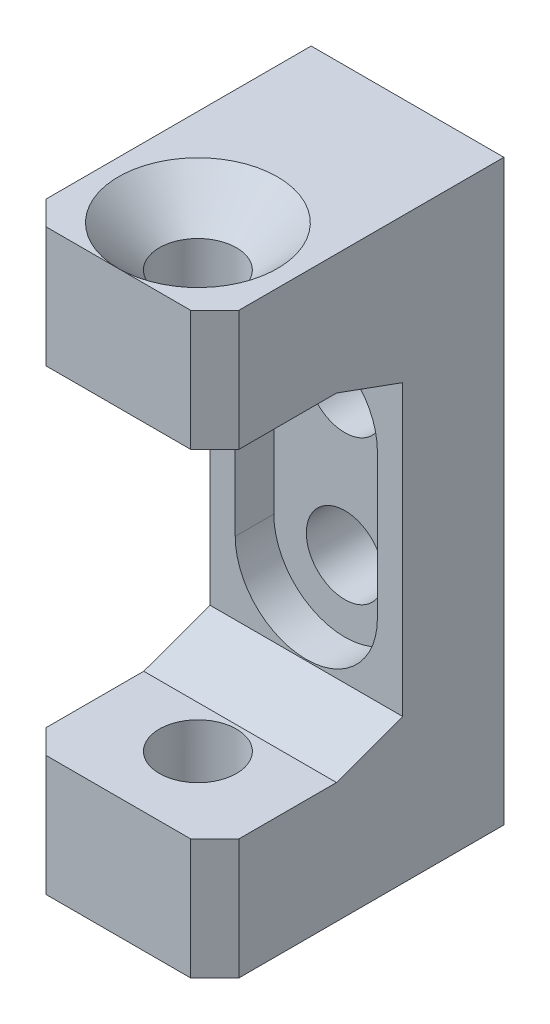
ISO-10303-21;
HEADER;
FILE_DESCRIPTION(('STEP AP214'),'2;1');
FILE_NAME('part.step','',(''),(''),'','','');
FILE_SCHEMA(('AUTOMOTIVE_DESIGN { 1 0 10303 214 1 1 1 1 }'));
ENDSEC;
DATA;
#1=APPLICATION_CONTEXT('core data for automotive mechanical design processes');
#2=APPLICATION_PROTOCOL_DEFINITION('international standard','automotive_design',2000,#1);
#3=PRODUCT_CONTEXT('',#1,'mechanical');
#4=PRODUCT('Part','Part','',(#3));
#5=PRODUCT_RELATED_PRODUCT_CATEGORY('part','',(#4));
#6=PRODUCT_DEFINITION_FORMATION('','',#4);
#7=PRODUCT_DEFINITION_CONTEXT('part definition',#1,'design');
#8=PRODUCT_DEFINITION('design','',#6,#7);
#9=PRODUCT_DEFINITION_SHAPE('','',#8);
#10=(LENGTH_UNIT() NAMED_UNIT(*) SI_UNIT(.MILLI.,.METRE.));
#11=(NAMED_UNIT(*) PLANE_ANGLE_UNIT() SI_UNIT($,.RADIAN.));
#12=(NAMED_UNIT(*) SI_UNIT($,.STERADIAN.) SOLID_ANGLE_UNIT());
#13=UNCERTAINTY_MEASURE_WITH_UNIT(LENGTH_MEASURE(1.E-05),#10,'distance_accuracy_value','');
#14=(GEOMETRIC_REPRESENTATION_CONTEXT(3) GLOBAL_UNCERTAINTY_ASSIGNED_CONTEXT((#13)) GLOBAL_UNIT_ASSIGNED_CONTEXT((#10,
#11,#12)) REPRESENTATION_CONTEXT('',''));
#15=CARTESIAN_POINT('',(0.,0.,0.));
#16=DIRECTION('',(0.,0.,1.));
#17=DIRECTION('',(1.,0.,0.));
#18=AXIS2_PLACEMENT_3D('',#15,#16,#17);
#19=CARTESIAN_POINT('',(101.,80.9999999999999,12.));
#20=DIRECTION('',(0.,1.,0.));
#21=DIRECTION('',(0.,0.,1.));
#22=AXIS2_PLACEMENT_3D('',#19,#20,#21);
#23=PLANE('',#22);
#24=DIRECTION('',(1.,0.,0.));
#25=VECTOR('',#24,1.);
#26=CARTESIAN_POINT('',(101.,80.9999999999999,12.));
#27=LINE('',#26,#25);
#28=CARTESIAN_POINT('',(93.9999999999999,80.9999999999999,12.));
#29=VERTEX_POINT('',#28);
#30=CARTESIAN_POINT('',(99.9999999999999,80.9999999999999,12.));
#31=VERTEX_POINT('',#30);
#32=EDGE_CURVE('E224',#29,#31,#27,.T.);
#33=ORIENTED_EDGE('',*,*,#32,.F.);
#34=DIRECTION('',(0.707106781186548,0.,0.707106781186547));
#35=VECTOR('',#34,1.);
#36=CARTESIAN_POINT('',(93.9999999999999,80.9999999999999,12.));
#37=LINE('',#36,#35);
#38=CARTESIAN_POINT('',(92.9999999999999,80.9999999999999,11.));
#39=VERTEX_POINT('',#38);
#40=EDGE_CURVE('E286',#29,#39,#37,.F.);
#41=ORIENTED_EDGE('',*,*,#40,.T.);
#42=DIRECTION('',(0.,0.,-1.));
#43=VECTOR('',#42,1.);
#44=CARTESIAN_POINT('',(92.9999999999999,80.9999999999999,12.));
#45=LINE('',#44,#43);
#46=CARTESIAN_POINT('',(92.9999999999999,80.9999999999999,0.));
#47=VERTEX_POINT('',#46);
#48=EDGE_CURVE('E241',#39,#47,#45,.T.);
#49=ORIENTED_EDGE('',*,*,#48,.T.);
#50=DIRECTION('',(1.,0.,0.));
#51=VECTOR('',#50,1.);
#52=CARTESIAN_POINT('',(101.,80.9999999999999,0.));
#53=LINE('',#52,#51);
#54=CARTESIAN_POINT('',(101.,80.9999999999999,0.));
#55=VERTEX_POINT('',#54);
#56=EDGE_CURVE('E237',#47,#55,#53,.T.);
#57=ORIENTED_EDGE('',*,*,#56,.T.);
#58=DIRECTION('',(0.,0.,-1.));
#59=VECTOR('',#58,1.);
#60=CARTESIAN_POINT('',(101.,80.9999999999999,12.));
#61=LINE('',#60,#59);
#62=CARTESIAN_POINT('',(101.,80.9999999999999,11.));
#63=VERTEX_POINT('',#62);
#64=EDGE_CURVE('E228',#63,#55,#61,.T.);
#65=ORIENTED_EDGE('',*,*,#64,.F.);
#66=DIRECTION('',(0.707106781186548,0.,-0.707106781186547));
#67=VECTOR('',#66,1.);
#68=CARTESIAN_POINT('',(99.9999999999999,80.9999999999999,12.));
#69=LINE('',#68,#67);
#70=EDGE_CURVE('E284',#63,#31,#69,.F.);
#71=ORIENTED_EDGE('',*,*,#70,.T.);
#72=EDGE_LOOP('',(#33,#41,#49,#57,#65,#71));
#73=FACE_BOUND('',#72,.T.);
#74=CARTESIAN_POINT('',(96.9999999999999,80.9999999999999,8.69999999999998));
#75=DIRECTION('',(0.,1.,0.));
#76=DIRECTION('',(0.,0.,1.));
#77=AXIS2_PLACEMENT_3D('',#74,#75,#76);
#78=CIRCLE('',#77,1.59999999999999);
#79=CARTESIAN_POINT('',(96.9999999999999,80.9999999999999,10.3));
#80=VERTEX_POINT('',#79);
#81=EDGE_CURVE('E278',#80,#80,#78,.F.);
#82=ORIENTED_EDGE('',*,*,#81,.F.);
#83=EDGE_LOOP('',(#82));
#84=FACE_BOUND('',#83,.T.);
#85=ADVANCED_FACE('F37',(#73,#84),#23,.F.);
#86=CARTESIAN_POINT('',(97.,95.9999999999999,4.2));
#87=DIRECTION('',(0.,0.,1.));
#88=DIRECTION('',(1.,0.,0.));
#89=AXIS2_PLACEMENT_3D('',#86,#87,#88);
#90=CYLINDRICAL_SURFACE('',#89,2.94999999999999);
#91=DIRECTION('',(0.,0.,1.));
#92=VECTOR('',#91,1.);
#93=CARTESIAN_POINT('',(99.9499999999999,96.,-10.6823190746195));
#94=LINE('',#93,#92);
#95=CARTESIAN_POINT('',(99.9499999999999,96.,2.6));
#96=VERTEX_POINT('',#95);
#97=CARTESIAN_POINT('',(99.9499999999999,96.,4.2));
#98=VERTEX_POINT('',#97);
#99=EDGE_CURVE('E167',#96,#98,#94,.T.);
#100=ORIENTED_EDGE('',*,*,#99,.T.);
#101=CARTESIAN_POINT('',(97.,95.9999999999999,4.2));
#102=DIRECTION('',(0.,0.,1.));
#103=DIRECTION('',(1.,0.,0.));
#104=AXIS2_PLACEMENT_3D('',#101,#102,#103);
#105=CIRCLE('',#104,2.94999999999999);
#106=CARTESIAN_POINT('',(94.05,96.,4.2));
#107=VERTEX_POINT('',#106);
#108=EDGE_CURVE('E194',#98,#107,#105,.T.);
#109=ORIENTED_EDGE('',*,*,#108,.T.);
#110=DIRECTION('',(0.,0.,1.));
#111=VECTOR('',#110,1.);
#112=CARTESIAN_POINT('',(94.05,96.,-10.6823190746195));
#113=LINE('',#112,#111);
#114=CARTESIAN_POINT('',(94.05,96.,2.6));
#115=VERTEX_POINT('',#114);
#116=EDGE_CURVE('E178',#115,#107,#113,.T.);
#117=ORIENTED_EDGE('',*,*,#116,.F.);
#118=CARTESIAN_POINT('',(97.,95.9999999999999,2.6));
#119=DIRECTION('',(0.,0.,1.));
#120=DIRECTION('',(1.,0.,0.));
#121=AXIS2_PLACEMENT_3D('',#118,#119,#120);
#122=CIRCLE('',#121,2.94999999999999);
#123=EDGE_CURVE('E186',#96,#115,#122,.T.);
#124=ORIENTED_EDGE('',*,*,#123,.F.);
#125=EDGE_LOOP('',(#100,#109,#117,#124));
#126=FACE_BOUND('',#125,.T.);
#127=ADVANCED_FACE('F192',(#126),#90,.F.);
#128=CARTESIAN_POINT('',(0.,0.,12.));
#129=DIRECTION('',(0.,0.,-1.));
#130=DIRECTION('',(-1.,0.,0.));
#131=AXIS2_PLACEMENT_3D('',#128,#129,#130);
#132=PLANE('',#131);
#133=DIRECTION('',(-1.,0.,0.));
#134=VECTOR('',#133,1.);
#135=CARTESIAN_POINT('',(0.,86.,12.));
#136=LINE('',#135,#134);
#137=CARTESIAN_POINT('',(99.9999999999999,86.,12.));
#138=VERTEX_POINT('',#137);
#139=CARTESIAN_POINT('',(93.9999999999999,86.,12.));
#140=VERTEX_POINT('',#139);
#141=EDGE_CURVE('E250',#138,#140,#136,.T.);
#142=ORIENTED_EDGE('',*,*,#141,.T.);
#143=DIRECTION('',(0.,-1.,0.));
#144=VECTOR('',#143,1.);
#145=CARTESIAN_POINT('',(93.9999999999999,0.,12.));
#146=LINE('',#145,#144);
#147=EDGE_CURVE('E281',#140,#29,#146,.T.);
#148=ORIENTED_EDGE('',*,*,#147,.T.);
#149=ORIENTED_EDGE('',*,*,#32,.T.);
#150=DIRECTION('',(0.,1.,0.));
#151=VECTOR('',#150,1.);
#152=CARTESIAN_POINT('',(99.9999999999998,0.,12.));
#153=LINE('',#152,#151);
#154=EDGE_CURVE('E273',#31,#138,#153,.T.);
#155=ORIENTED_EDGE('',*,*,#154,.T.);
#156=EDGE_LOOP('',(#142,#148,#149,#155));
#157=FACE_BOUND('',#156,.T.);
#158=ADVANCED_FACE('F381',(#157),#132,.F.);
#159=CARTESIAN_POINT('',(101.,105.,12.));
#160=DIRECTION('',(-1.,0.,0.));
#161=DIRECTION('',(0.,-1.,0.));
#162=AXIS2_PLACEMENT_3D('',#159,#160,#161);
#163=PLANE('',#162);
#164=DIRECTION('',(0.,0.,1.));
#165=VECTOR('',#164,1.);
#166=CARTESIAN_POINT('',(101.,86.,12.));
#167=LINE('',#166,#165);
#168=CARTESIAN_POINT('',(101.,86.,6.94747741945469));
#169=VERTEX_POINT('',#168);
#170=CARTESIAN_POINT('',(101.,86.,11.));
#171=VERTEX_POINT('',#170);
#172=EDGE_CURVE('E215',#169,#171,#167,.T.);
#173=ORIENTED_EDGE('',*,*,#172,.T.);
#174=DIRECTION('',(0.,-1.,0.));
#175=VECTOR('',#174,1.);
#176=CARTESIAN_POINT('',(101.,105.,11.));
#177=LINE('',#176,#175);
#178=EDGE_CURVE('E298',#171,#63,#177,.T.);
#179=ORIENTED_EDGE('',*,*,#178,.T.);
#180=ORIENTED_EDGE('',*,*,#64,.T.);
#181=DIRECTION('',(0.,1.,0.));
#182=VECTOR('',#181,1.);
#183=CARTESIAN_POINT('',(101.,105.,0.));
#184=LINE('',#183,#182);
#185=CARTESIAN_POINT('',(101.,105.,0.));
#186=VERTEX_POINT('',#185);
#187=EDGE_CURVE('E221',#55,#186,#184,.T.);
#188=ORIENTED_EDGE('',*,*,#187,.T.);
#189=DIRECTION('',(0.,0.,-1.));
#190=VECTOR('',#189,1.);
#191=CARTESIAN_POINT('',(101.,105.,12.));
#192=LINE('',#191,#190);
#193=CARTESIAN_POINT('',(101.,105.,11.));
#194=VERTEX_POINT('',#193);
#195=EDGE_CURVE('E245',#194,#186,#192,.T.);
#196=ORIENTED_EDGE('',*,*,#195,.F.);
#197=DIRECTION('',(0.,-1.,0.));
#198=VECTOR('',#197,1.);
#199=CARTESIAN_POINT('',(101.,105.,11.));
#200=LINE('',#199,#198);
#201=CARTESIAN_POINT('',(101.,100.,11.));
#202=VERTEX_POINT('',#201);
#203=EDGE_CURVE('E296',#194,#202,#200,.T.);
#204=ORIENTED_EDGE('',*,*,#203,.T.);
#205=DIRECTION('',(0.,0.,-1.));
#206=VECTOR('',#205,1.);
#207=CARTESIAN_POINT('',(101.,100.,12.));
#208=LINE('',#207,#206);
#209=CARTESIAN_POINT('',(101.,100.,6.94747741945465));
#210=VERTEX_POINT('',#209);
#211=EDGE_CURVE('E213',#202,#210,#208,.T.);
#212=ORIENTED_EDGE('',*,*,#211,.T.);
#213=DIRECTION('',(0.,0.342020143325666,0.939692620785909));
#214=VECTOR('',#213,1.);
#215=CARTESIAN_POINT('',(101.,102.20873834842,13.0159361572236));
#216=LINE('',#215,#214);
#217=CARTESIAN_POINT('',(101.,99.,4.2));
#218=VERTEX_POINT('',#217);
#219=EDGE_CURVE('E271',#210,#218,#216,.F.);
#220=ORIENTED_EDGE('',*,*,#219,.T.);
#221=DIRECTION('',(0.,-1.,0.));
#222=VECTOR('',#221,1.);
#223=CARTESIAN_POINT('',(101.,105.,4.2));
#224=LINE('',#223,#222);
#225=CARTESIAN_POINT('',(101.,87.,4.2));
#226=VERTEX_POINT('',#225);
#227=EDGE_CURVE('E218',#218,#226,#224,.T.);
#228=ORIENTED_EDGE('',*,*,#227,.T.);
#229=DIRECTION('',(0.,0.342020143325662,-0.939692620785911));
#230=VECTOR('',#229,1.);
#231=CARTESIAN_POINT('',(101.,86.5987283341516,5.30248484098533));
#232=LINE('',#231,#230);
#233=EDGE_CURVE('E266',#226,#169,#232,.F.);
#234=ORIENTED_EDGE('',*,*,#233,.T.);
#235=EDGE_LOOP('',(#173,#179,#180,#188,#196,#204,#212,#220,#228,#234));
#236=FACE_BOUND('',#235,.T.);
#237=ADVANCED_FACE('F391',(#236),#163,.F.);
#238=CARTESIAN_POINT('',(101.,105.,12.));
#239=DIRECTION('',(0.,-1.,0.));
#240=DIRECTION('',(0.,0.,-1.));
#241=AXIS2_PLACEMENT_3D('',#238,#239,#240);
#242=PLANE('',#241);
#243=DIRECTION('',(-1.,0.,0.));
#244=VECTOR('',#243,1.);
#245=CARTESIAN_POINT('',(101.,105.,12.));
#246=LINE('',#245,#244);
#247=CARTESIAN_POINT('',(99.9999999999999,105.,12.));
#248=VERTEX_POINT('',#247);
#249=CARTESIAN_POINT('',(96.9999999999999,105.,12.));
#250=VERTEX_POINT('',#249);
#251=EDGE_CURVE('E222',#248,#250,#246,.T.);
#252=ORIENTED_EDGE('',*,*,#251,.F.);
#253=DIRECTION('',(-0.707106781186548,0.,0.707106781186547));
#254=VECTOR('',#253,1.);
#255=CARTESIAN_POINT('',(99.9999999999999,105.,12.));
#256=LINE('',#255,#254);
#257=EDGE_CURVE('E61',#248,#194,#256,.F.);
#258=ORIENTED_EDGE('',*,*,#257,.T.);
#259=ORIENTED_EDGE('',*,*,#195,.T.);
#260=DIRECTION('',(-1.,0.,0.));
#261=VECTOR('',#260,1.);
#262=CARTESIAN_POINT('',(101.,105.,0.));
#263=LINE('',#262,#261);
#264=CARTESIAN_POINT('',(92.9999999999999,105.,0.));
#265=VERTEX_POINT('',#264);
#266=EDGE_CURVE('E231',#186,#265,#263,.T.);
#267=ORIENTED_EDGE('',*,*,#266,.T.);
#268=DIRECTION('',(0.,0.,-1.));
#269=VECTOR('',#268,1.);
#270=CARTESIAN_POINT('',(92.9999999999999,105.,12.));
#271=LINE('',#270,#269);
#272=CARTESIAN_POINT('',(92.9999999999999,105.,11.));
#273=VERTEX_POINT('',#272);
#274=EDGE_CURVE('E243',#273,#265,#271,.T.);
#275=ORIENTED_EDGE('',*,*,#274,.F.);
#276=DIRECTION('',(-0.707106781186548,0.,-0.707106781186547));
#277=VECTOR('',#276,1.);
#278=CARTESIAN_POINT('',(93.9999999999999,105.,12.));
#279=LINE('',#278,#277);
#280=CARTESIAN_POINT('',(93.9999999999999,105.,12.));
#281=VERTEX_POINT('',#280);
#282=EDGE_CURVE('E53',#273,#281,#279,.F.);
#283=ORIENTED_EDGE('',*,*,#282,.T.);
#284=EDGE_CURVE('E225',#250,#281,#246,.T.);
#285=ORIENTED_EDGE('',*,*,#284,.F.);
#286=CARTESIAN_POINT('',(96.9999999999999,105.,8.69999999999998));
#287=DIRECTION('',(0.,1.,0.));
#288=DIRECTION('',(0.,0.,1.));
#289=AXIS2_PLACEMENT_3D('',#286,#287,#288);
#290=CIRCLE('',#289,3.3);
#291=EDGE_CURVE('E325',#250,#250,#290,.T.);
#292=ORIENTED_EDGE('',*,*,#291,.F.);
#293=EDGE_LOOP('',(#252,#258,#259,#267,#275,#283,#285,#292));
#294=FACE_BOUND('',#293,.T.);
#295=ADVANCED_FACE('F324',(#294),#242,.F.);
#296=CARTESIAN_POINT('',(92.9999999999999,105.,12.));
#297=DIRECTION('',(1.,0.,0.));
#298=DIRECTION('',(0.,1.,0.));
#299=AXIS2_PLACEMENT_3D('',#296,#297,#298);
#300=PLANE('',#299);
#301=ORIENTED_EDGE('',*,*,#48,.F.);
#302=DIRECTION('',(0.,1.,0.));
#303=VECTOR('',#302,1.);
#304=CARTESIAN_POINT('',(92.9999999999999,105.,11.));
#305=LINE('',#304,#303);
#306=CARTESIAN_POINT('',(93.,86.,11.));
#307=VERTEX_POINT('',#306);
#308=EDGE_CURVE('E290',#39,#307,#305,.T.);
#309=ORIENTED_EDGE('',*,*,#308,.T.);
#310=DIRECTION('',(0.,0.,1.));
#311=VECTOR('',#310,1.);
#312=CARTESIAN_POINT('',(93.,86.,4.2));
#313=LINE('',#312,#311);
#314=CARTESIAN_POINT('',(93.,86.,6.94747741945469));
#315=VERTEX_POINT('',#314);
#316=EDGE_CURVE('E210',#315,#307,#313,.T.);
#317=ORIENTED_EDGE('',*,*,#316,.F.);
#318=DIRECTION('',(0.,-0.342020143325662,0.939692620785911));
#319=VECTOR('',#318,1.);
#320=CARTESIAN_POINT('',(92.9999999999999,86.5987283341516,5.30248484098533));
#321=LINE('',#320,#319);
#322=CARTESIAN_POINT('',(93.,87.,4.2));
#323=VERTEX_POINT('',#322);
#324=EDGE_CURVE('E264',#315,#323,#321,.F.);
#325=ORIENTED_EDGE('',*,*,#324,.T.);
#326=DIRECTION('',(0.,-1.,0.));
#327=VECTOR('',#326,1.);
#328=CARTESIAN_POINT('',(93.,100.,4.2));
#329=LINE('',#328,#327);
#330=CARTESIAN_POINT('',(93.,99.,4.2));
#331=VERTEX_POINT('',#330);
#332=EDGE_CURVE('E207',#331,#323,#329,.T.);
#333=ORIENTED_EDGE('',*,*,#332,.F.);
#334=DIRECTION('',(0.,-0.342020143325666,-0.939692620785909));
#335=VECTOR('',#334,1.);
#336=CARTESIAN_POINT('',(92.9999999999999,102.208738348421,13.0159361572236));
#337=LINE('',#336,#335);
#338=CARTESIAN_POINT('',(93.,100.,6.94747741945465));
#339=VERTEX_POINT('',#338);
#340=EDGE_CURVE('E268',#331,#339,#337,.F.);
#341=ORIENTED_EDGE('',*,*,#340,.T.);
#342=DIRECTION('',(0.,0.,-1.));
#343=VECTOR('',#342,1.);
#344=CARTESIAN_POINT('',(93.,100.,4.2));
#345=LINE('',#344,#343);
#346=CARTESIAN_POINT('',(93.,100.,11.));
#347=VERTEX_POINT('',#346);
#348=EDGE_CURVE('E205',#347,#339,#345,.T.);
#349=ORIENTED_EDGE('',*,*,#348,.F.);
#350=DIRECTION('',(0.,1.,0.));
#351=VECTOR('',#350,1.);
#352=CARTESIAN_POINT('',(92.9999999999999,105.,11.));
#353=LINE('',#352,#351);
#354=EDGE_CURVE('E288',#347,#273,#353,.T.);
#355=ORIENTED_EDGE('',*,*,#354,.T.);
#356=ORIENTED_EDGE('',*,*,#274,.T.);
#357=DIRECTION('',(0.,-1.,0.));
#358=VECTOR('',#357,1.);
#359=CARTESIAN_POINT('',(92.9999999999999,105.,0.));
#360=LINE('',#359,#358);
#361=EDGE_CURVE('E234',#265,#47,#360,.T.);
#362=ORIENTED_EDGE('',*,*,#361,.T.);
#363=EDGE_LOOP('',(#301,#309,#317,#325,#333,#341,#349,#355,#356,#362));
#364=FACE_BOUND('',#363,.T.);
#365=ADVANCED_FACE('F316',(#364),#300,.F.);
#366=DIRECTION('',(1.,0.,0.));
#367=VECTOR('',#366,1.);
#368=CARTESIAN_POINT('',(0.,100.,12.));
#369=LINE('',#368,#367);
#370=CARTESIAN_POINT('',(93.9999999999999,100.,12.));
#371=VERTEX_POINT('',#370);
#372=CARTESIAN_POINT('',(99.9999999999999,100.,12.));
#373=VERTEX_POINT('',#372);
#374=EDGE_CURVE('E247',#371,#373,#369,.T.);
#375=ORIENTED_EDGE('',*,*,#374,.T.);
#376=DIRECTION('',(0.,1.,0.));
#377=VECTOR('',#376,1.);
#378=CARTESIAN_POINT('',(99.9999999999998,0.,12.));
#379=LINE('',#378,#377);
#380=EDGE_CURVE('E303',#373,#248,#379,.T.);
#381=ORIENTED_EDGE('',*,*,#380,.T.);
#382=ORIENTED_EDGE('',*,*,#251,.T.);
#383=ORIENTED_EDGE('',*,*,#284,.T.);
#384=DIRECTION('',(0.,-1.,0.));
#385=VECTOR('',#384,1.);
#386=CARTESIAN_POINT('',(93.9999999999999,0.,12.));
#387=LINE('',#386,#385);
#388=EDGE_CURVE('E300',#281,#371,#387,.T.);
#389=ORIENTED_EDGE('',*,*,#388,.T.);
#390=EDGE_LOOP('',(#375,#381,#382,#383,#389));
#391=FACE_BOUND('',#390,.T.);
#392=ADVANCED_FACE('F320',(#391),#132,.F.);
#393=CARTESIAN_POINT('',(0.,0.,0.));
#394=DIRECTION('',(0.,0.,-1.));
#395=DIRECTION('',(-1.,0.,0.));
#396=AXIS2_PLACEMENT_3D('',#393,#394,#395);
#397=PLANE('',#396);
#398=CARTESIAN_POINT('',(97.,89.9999999999999,0.));
#399=DIRECTION('',(0.,0.,1.));
#400=DIRECTION('',(1.,0.,0.));
#401=AXIS2_PLACEMENT_3D('',#398,#399,#400);
#402=CIRCLE('',#401,1.6);
#403=CARTESIAN_POINT('',(98.6,89.9999999999999,0.));
#404=VERTEX_POINT('',#403);
#405=EDGE_CURVE('E199',#404,#404,#402,.T.);
#406=ORIENTED_EDGE('',*,*,#405,.T.);
#407=EDGE_LOOP('',(#406));
#408=FACE_BOUND('',#407,.T.);
#409=CARTESIAN_POINT('',(97.,95.9999999999999,0.));
#410=DIRECTION('',(0.,0.,1.));
#411=DIRECTION('',(1.,0.,0.));
#412=AXIS2_PLACEMENT_3D('',#409,#410,#411);
#413=CIRCLE('',#412,1.6);
#414=CARTESIAN_POINT('',(98.6,95.9999999999999,0.));
#415=VERTEX_POINT('',#414);
#416=EDGE_CURVE('E197',#415,#415,#413,.T.);
#417=ORIENTED_EDGE('',*,*,#416,.T.);
#418=EDGE_LOOP('',(#417));
#419=FACE_BOUND('',#418,.T.);
#420=ORIENTED_EDGE('',*,*,#187,.F.);
#421=ORIENTED_EDGE('',*,*,#56,.F.);
#422=ORIENTED_EDGE('',*,*,#361,.F.);
#423=ORIENTED_EDGE('',*,*,#266,.F.);
#424=EDGE_LOOP('',(#420,#421,#422,#423));
#425=FACE_BOUND('',#424,.T.);
#426=ADVANCED_FACE('F354',(#408,#419,#425),#397,.T.);
#427=CARTESIAN_POINT('',(133.,99.9999999999999,4.2));
#428=DIRECTION('',(0.,0.,-1.));
#429=DIRECTION('',(-1.,0.,0.));
#430=AXIS2_PLACEMENT_3D('',#427,#428,#429);
#431=PLANE('',#430);
#432=ORIENTED_EDGE('',*,*,#108,.F.);
#433=DIRECTION('',(0.,1.,0.));
#434=VECTOR('',#433,1.);
#435=CARTESIAN_POINT('',(99.95,89.9999999999999,4.2));
#436=LINE('',#435,#434);
#437=CARTESIAN_POINT('',(99.95,89.9999999999999,4.2));
#438=VERTEX_POINT('',#437);
#439=EDGE_CURVE('E173',#438,#98,#436,.T.);
#440=ORIENTED_EDGE('',*,*,#439,.F.);
#441=CARTESIAN_POINT('',(97.,89.9999999999999,4.2));
#442=DIRECTION('',(0.,0.,1.));
#443=DIRECTION('',(1.,0.,0.));
#444=AXIS2_PLACEMENT_3D('',#441,#442,#443);
#445=CIRCLE('',#444,2.94999999999999);
#446=CARTESIAN_POINT('',(94.05,89.9999999999999,4.2));
#447=VERTEX_POINT('',#446);
#448=EDGE_CURVE('E345',#447,#438,#445,.T.);
#449=ORIENTED_EDGE('',*,*,#448,.F.);
#450=DIRECTION('',(0.,-1.,0.));
#451=VECTOR('',#450,1.);
#452=CARTESIAN_POINT('',(94.05,89.9999999999999,4.2));
#453=LINE('',#452,#451);
#454=EDGE_CURVE('E189',#107,#447,#453,.T.);
#455=ORIENTED_EDGE('',*,*,#454,.F.);
#456=EDGE_LOOP('',(#432,#440,#449,#455));
#457=FACE_BOUND('',#456,.T.);
#458=ORIENTED_EDGE('',*,*,#332,.T.);
#459=DIRECTION('',(1.,0.,0.));
#460=VECTOR('',#459,1.);
#461=CARTESIAN_POINT('',(101.,87.,4.2));
#462=LINE('',#461,#460);
#463=EDGE_CURVE('E259',#323,#226,#462,.T.);
#464=ORIENTED_EDGE('',*,*,#463,.T.);
#465=ORIENTED_EDGE('',*,*,#227,.F.);
#466=DIRECTION('',(-1.,0.,0.));
#467=VECTOR('',#466,1.);
#468=CARTESIAN_POINT('',(93.,99.,4.2));
#469=LINE('',#468,#467);
#470=EDGE_CURVE('E256',#218,#331,#469,.T.);
#471=ORIENTED_EDGE('',*,*,#470,.T.);
#472=EDGE_LOOP('',(#458,#464,#465,#471));
#473=FACE_BOUND('',#472,.T.);
#474=ADVANCED_FACE('F456',(#457,#473),#431,.F.);
#475=CARTESIAN_POINT('',(133.,86.,4.2));
#476=DIRECTION('',(0.,-1.,0.));
#477=DIRECTION('',(1.,0.,0.));
#478=AXIS2_PLACEMENT_3D('',#475,#476,#477);
#479=PLANE('',#478);
#480=CARTESIAN_POINT('',(96.9999999999999,86.,8.69999999999998));
#481=DIRECTION('',(0.,-1.,0.));
#482=DIRECTION('',(1.,0.,0.));
#483=AXIS2_PLACEMENT_3D('',#480,#481,#482);
#484=CIRCLE('',#483,1.59999999999999);
#485=CARTESIAN_POINT('',(98.5999999999999,86.,8.69999999999998));
#486=VERTEX_POINT('',#485);
#487=EDGE_CURVE('E274',#486,#486,#484,.T.);
#488=ORIENTED_EDGE('',*,*,#487,.T.);
#489=EDGE_LOOP('',(#488));
#490=FACE_BOUND('',#489,.T.);
#491=ORIENTED_EDGE('',*,*,#316,.T.);
#492=DIRECTION('',(-0.707106781186548,0.,-0.707106781186547));
#493=VECTOR('',#492,1.);
#494=CARTESIAN_POINT('',(93.9999999999999,86.,12.));
#495=LINE('',#494,#493);
#496=EDGE_CURVE('E294',#307,#140,#495,.F.);
#497=ORIENTED_EDGE('',*,*,#496,.T.);
#498=ORIENTED_EDGE('',*,*,#141,.F.);
#499=DIRECTION('',(-0.707106781186548,0.,0.707106781186547));
#500=VECTOR('',#499,1.);
#501=CARTESIAN_POINT('',(99.9999999999999,86.,12.));
#502=LINE('',#501,#500);
#503=EDGE_CURVE('E292',#138,#171,#502,.F.);
#504=ORIENTED_EDGE('',*,*,#503,.T.);
#505=ORIENTED_EDGE('',*,*,#172,.F.);
#506=DIRECTION('',(-1.,0.,0.));
#507=VECTOR('',#506,1.);
#508=CARTESIAN_POINT('',(93.,86.,6.94747741945469));
#509=LINE('',#508,#507);
#510=EDGE_CURVE('E253',#169,#315,#509,.T.);
#511=ORIENTED_EDGE('',*,*,#510,.T.);
#512=EDGE_LOOP('',(#491,#497,#498,#504,#505,#511));
#513=FACE_BOUND('',#512,.T.);
#514=ADVANCED_FACE('F445',(#490,#513),#479,.F.);
#515=CARTESIAN_POINT('',(133.,99.9999999999999,4.2));
#516=DIRECTION('',(0.,1.,0.));
#517=DIRECTION('',(-1.,0.,0.));
#518=AXIS2_PLACEMENT_3D('',#515,#516,#517);
#519=PLANE('',#518);
#520=CARTESIAN_POINT('',(96.9999999999999,100.,8.69999999999998));
#521=DIRECTION('',(0.,1.,0.));
#522=DIRECTION('',(-1.,0.,0.));
#523=AXIS2_PLACEMENT_3D('',#520,#521,#522);
#524=CIRCLE('',#523,1.59999999999999);
#525=CARTESIAN_POINT('',(95.4,100.,8.69999999999998));
#526=VERTEX_POINT('',#525);
#527=EDGE_CURVE('E277',#526,#526,#524,.T.);
#528=ORIENTED_EDGE('',*,*,#527,.T.);
#529=EDGE_LOOP('',(#528));
#530=FACE_BOUND('',#529,.T.);
#531=ORIENTED_EDGE('',*,*,#211,.F.);
#532=DIRECTION('',(0.707106781186548,0.,-0.707106781186547));
#533=VECTOR('',#532,1.);
#534=CARTESIAN_POINT('',(99.9999999999999,100.,12.));
#535=LINE('',#534,#533);
#536=EDGE_CURVE('E11',#202,#373,#535,.F.);
#537=ORIENTED_EDGE('',*,*,#536,.T.);
#538=ORIENTED_EDGE('',*,*,#374,.F.);
#539=DIRECTION('',(0.707106781186548,0.,0.707106781186547));
#540=VECTOR('',#539,1.);
#541=CARTESIAN_POINT('',(93.9999999999999,100.,12.0000000000001));
#542=LINE('',#541,#540);
#543=EDGE_CURVE('E46',#371,#347,#542,.F.);
#544=ORIENTED_EDGE('',*,*,#543,.T.);
#545=ORIENTED_EDGE('',*,*,#348,.T.);
#546=DIRECTION('',(1.,0.,0.));
#547=VECTOR('',#546,1.);
#548=CARTESIAN_POINT('',(101.,100.,6.94747741945465));
#549=LINE('',#548,#547);
#550=EDGE_CURVE('E261',#339,#210,#549,.T.);
#551=ORIENTED_EDGE('',*,*,#550,.T.);
#552=EDGE_LOOP('',(#531,#537,#538,#544,#545,#551));
#553=FACE_BOUND('',#552,.T.);
#554=ADVANCED_FACE('F310',(#530,#553),#519,.F.);
#555=CARTESIAN_POINT('',(133.,86.,6.94747741945469));
#556=DIRECTION('',(0.,0.939692620785911,0.342020143325662));
#557=DIRECTION('',(1.,0.,0.));
#558=AXIS2_PLACEMENT_3D('',#555,#556,#557);
#559=PLANE('',#558);
#560=ORIENTED_EDGE('',*,*,#233,.F.);
#561=ORIENTED_EDGE('',*,*,#463,.F.);
#562=ORIENTED_EDGE('',*,*,#324,.F.);
#563=ORIENTED_EDGE('',*,*,#510,.F.);
#564=EDGE_LOOP('',(#560,#561,#562,#563));
#565=FACE_BOUND('',#564,.T.);
#566=ADVANCED_FACE('F396',(#565),#559,.T.);
#567=CARTESIAN_POINT('',(133.,98.9999999999999,4.2));
#568=DIRECTION('',(0.,-0.939692620785909,0.342020143325666));
#569=DIRECTION('',(1.,0.,0.));
#570=AXIS2_PLACEMENT_3D('',#567,#568,#569);
#571=PLANE('',#570);
#572=ORIENTED_EDGE('',*,*,#219,.F.);
#573=ORIENTED_EDGE('',*,*,#550,.F.);
#574=ORIENTED_EDGE('',*,*,#340,.F.);
#575=ORIENTED_EDGE('',*,*,#470,.F.);
#576=EDGE_LOOP('',(#572,#573,#574,#575));
#577=FACE_BOUND('',#576,.T.);
#578=ADVANCED_FACE('F370',(#577),#571,.T.);
#579=CARTESIAN_POINT('',(97.,95.9999999999999,4.2));
#580=DIRECTION('',(0.,0.,1.));
#581=DIRECTION('',(1.,0.,0.));
#582=AXIS2_PLACEMENT_3D('',#579,#580,#581);
#583=CYLINDRICAL_SURFACE('',#582,1.6);
#584=ORIENTED_EDGE('',*,*,#416,.F.);
#585=EDGE_LOOP('',(#584));
#586=FACE_BOUND('',#585,.T.);
#587=CARTESIAN_POINT('',(97.,95.9999999999999,2.6));
#588=DIRECTION('',(0.,0.,1.));
#589=DIRECTION('',(1.,0.,0.));
#590=AXIS2_PLACEMENT_3D('',#587,#588,#589);
#591=CIRCLE('',#590,1.6);
#592=CARTESIAN_POINT('',(98.6,95.9999999999999,2.6));
#593=VERTEX_POINT('',#592);
#594=EDGE_CURVE('E193',#593,#593,#591,.T.);
#595=ORIENTED_EDGE('',*,*,#594,.T.);
#596=EDGE_LOOP('',(#595));
#597=FACE_BOUND('',#596,.T.);
#598=ADVANCED_FACE('F364',(#586,#597),#583,.F.);
#599=CARTESIAN_POINT('',(98.6,95.9999999999999,2.6));
#600=DIRECTION('',(0.,0.,-1.));
#601=DIRECTION('',(-1.,0.,0.));
#602=AXIS2_PLACEMENT_3D('',#599,#600,#601);
#603=PLANE('',#602);
#604=ORIENTED_EDGE('',*,*,#594,.F.);
#605=EDGE_LOOP('',(#604));
#606=FACE_BOUND('',#605,.T.);
#607=ORIENTED_EDGE('',*,*,#123,.T.);
#608=DIRECTION('',(0.,-1.,0.));
#609=VECTOR('',#608,1.);
#610=CARTESIAN_POINT('',(94.05,89.9999999999999,2.6));
#611=LINE('',#610,#609);
#612=CARTESIAN_POINT('',(94.05,89.9999999999999,2.6));
#613=VERTEX_POINT('',#612);
#614=EDGE_CURVE('E337',#115,#613,#611,.T.);
#615=ORIENTED_EDGE('',*,*,#614,.T.);
#616=CARTESIAN_POINT('',(97.,89.9999999999999,2.6));
#617=DIRECTION('',(0.,0.,1.));
#618=DIRECTION('',(1.,0.,0.));
#619=AXIS2_PLACEMENT_3D('',#616,#617,#618);
#620=CIRCLE('',#619,2.94999999999999);
#621=CARTESIAN_POINT('',(99.95,89.9999999999999,2.6));
#622=VERTEX_POINT('',#621);
#623=EDGE_CURVE('E188',#613,#622,#620,.T.);
#624=ORIENTED_EDGE('',*,*,#623,.T.);
#625=DIRECTION('',(0.,1.,0.));
#626=VECTOR('',#625,1.);
#627=CARTESIAN_POINT('',(99.95,89.9999999999999,2.6));
#628=LINE('',#627,#626);
#629=EDGE_CURVE('E170',#622,#96,#628,.T.);
#630=ORIENTED_EDGE('',*,*,#629,.T.);
#631=EDGE_LOOP('',(#607,#615,#624,#630));
#632=FACE_BOUND('',#631,.T.);
#633=CARTESIAN_POINT('',(97.,89.9999999999999,2.6));
#634=DIRECTION('',(0.,0.,1.));
#635=DIRECTION('',(1.,0.,0.));
#636=AXIS2_PLACEMENT_3D('',#633,#634,#635);
#637=CIRCLE('',#636,1.6);
#638=CARTESIAN_POINT('',(98.6,89.9999999999999,2.6));
#639=VERTEX_POINT('',#638);
#640=EDGE_CURVE('E349',#639,#639,#637,.T.);
#641=ORIENTED_EDGE('',*,*,#640,.F.);
#642=EDGE_LOOP('',(#641));
#643=FACE_BOUND('',#642,.T.);
#644=ADVANCED_FACE('F183',(#606,#632,#643),#603,.F.);
#645=CARTESIAN_POINT('',(97.,89.9999999999999,4.2));
#646=DIRECTION('',(0.,0.,1.));
#647=DIRECTION('',(1.,0.,0.));
#648=AXIS2_PLACEMENT_3D('',#645,#646,#647);
#649=CYLINDRICAL_SURFACE('',#648,1.6);
#650=ORIENTED_EDGE('',*,*,#405,.F.);
#651=EDGE_LOOP('',(#650));
#652=FACE_BOUND('',#651,.T.);
#653=ORIENTED_EDGE('',*,*,#640,.T.);
#654=EDGE_LOOP('',(#653));
#655=FACE_BOUND('',#654,.T.);
#656=ADVANCED_FACE('F357',(#652,#655),#649,.F.);
#657=CARTESIAN_POINT('',(97.,89.9999999999999,4.2));
#658=DIRECTION('',(0.,0.,1.));
#659=DIRECTION('',(1.,0.,0.));
#660=AXIS2_PLACEMENT_3D('',#657,#658,#659);
#661=CYLINDRICAL_SURFACE('',#660,2.94999999999999);
#662=ORIENTED_EDGE('',*,*,#448,.T.);
#663=DIRECTION('',(0.,0.,1.));
#664=VECTOR('',#663,1.);
#665=CARTESIAN_POINT('',(99.95,89.9999999999999,-10.6823190746195));
#666=LINE('',#665,#664);
#667=EDGE_CURVE('E342',#622,#438,#666,.T.);
#668=ORIENTED_EDGE('',*,*,#667,.F.);
#669=ORIENTED_EDGE('',*,*,#623,.F.);
#670=DIRECTION('',(0.,0.,1.));
#671=VECTOR('',#670,1.);
#672=CARTESIAN_POINT('',(94.05,89.9999999999999,-10.6823190746195));
#673=LINE('',#672,#671);
#674=EDGE_CURVE('E339',#613,#447,#673,.T.);
#675=ORIENTED_EDGE('',*,*,#674,.T.);
#676=EDGE_LOOP('',(#662,#668,#669,#675));
#677=FACE_BOUND('',#676,.T.);
#678=ADVANCED_FACE('F360',(#677),#661,.F.);
#679=CARTESIAN_POINT('',(99.95,89.9999999999999,-10.6823190746195));
#680=DIRECTION('',(1.,0.,0.));
#681=DIRECTION('',(0.,0.,-1.));
#682=AXIS2_PLACEMENT_3D('',#679,#680,#681);
#683=PLANE('',#682);
#684=ORIENTED_EDGE('',*,*,#667,.T.);
#685=ORIENTED_EDGE('',*,*,#439,.T.);
#686=ORIENTED_EDGE('',*,*,#99,.F.);
#687=ORIENTED_EDGE('',*,*,#629,.F.);
#688=EDGE_LOOP('',(#684,#685,#686,#687));
#689=FACE_BOUND('',#688,.T.);
#690=ADVANCED_FACE('F169',(#689),#683,.F.);
#691=CARTESIAN_POINT('',(94.05,89.9999999999999,-10.6823190746195));
#692=DIRECTION('',(-1.,0.,0.));
#693=DIRECTION('',(0.,0.,1.));
#694=AXIS2_PLACEMENT_3D('',#691,#692,#693);
#695=PLANE('',#694);
#696=ORIENTED_EDGE('',*,*,#116,.T.);
#697=ORIENTED_EDGE('',*,*,#454,.T.);
#698=ORIENTED_EDGE('',*,*,#674,.F.);
#699=ORIENTED_EDGE('',*,*,#614,.F.);
#700=EDGE_LOOP('',(#696,#697,#698,#699));
#701=FACE_BOUND('',#700,.T.);
#702=ADVANCED_FACE('F555',(#701),#695,.F.);
#703=CARTESIAN_POINT('',(96.9999999999999,105.,8.69999999999998));
#704=DIRECTION('',(0.,1.,0.));
#705=DIRECTION('',(0.,0.,1.));
#706=AXIS2_PLACEMENT_3D('',#703,#704,#705);
#707=CYLINDRICAL_SURFACE('',#706,1.59999999999999);
#708=ORIENTED_EDGE('',*,*,#81,.T.);
#709=EDGE_LOOP('',(#708));
#710=FACE_BOUND('',#709,.T.);
#711=ORIENTED_EDGE('',*,*,#487,.F.);
#712=EDGE_LOOP('',(#711));
#713=FACE_BOUND('',#712,.T.);
#714=ADVANCED_FACE('F547',(#710,#713),#707,.F.);
#715=CARTESIAN_POINT('',(96.9999999999999,103.3,8.69999999999998));
#716=DIRECTION('',(0.,1.,0.));
#717=DIRECTION('',(0.,0.,1.));
#718=AXIS2_PLACEMENT_3D('',#715,#716,#717);
#719=CIRCLE('',#718,1.59999999999999);
#720=CARTESIAN_POINT('',(96.9999999999999,103.3,10.3));
#721=VERTEX_POINT('',#720);
#722=EDGE_CURVE('E327',#721,#721,#719,.T.);
#723=ORIENTED_EDGE('',*,*,#722,.T.);
#724=EDGE_LOOP('',(#723));
#725=FACE_BOUND('',#724,.T.);
#726=ORIENTED_EDGE('',*,*,#527,.F.);
#727=EDGE_LOOP('',(#726));
#728=FACE_BOUND('',#727,.T.);
#729=ADVANCED_FACE('F540',(#725,#728),#707,.F.);
#730=CARTESIAN_POINT('',(96.9999999999999,105.,8.69999999999998));
#731=DIRECTION('',(0.,1.,0.));
#732=DIRECTION('',(0.,0.,1.));
#733=AXIS2_PLACEMENT_3D('',#730,#731,#732);
#734=CONICAL_SURFACE('',#733,3.3,0.785398163397448);
#735=ORIENTED_EDGE('',*,*,#722,.F.);
#736=EDGE_LOOP('',(#735));
#737=FACE_BOUND('',#736,.T.);
#738=ORIENTED_EDGE('',*,*,#291,.T.);
#739=EDGE_LOOP('',(#738));
#740=FACE_BOUND('',#739,.T.);
#741=ADVANCED_FACE('F416',(#737,#740),#734,.F.);
#742=CARTESIAN_POINT('',(93.9999999999999,0.,12.));
#743=DIRECTION('',(0.707106781186547,0.,-0.707106781186548));
#744=DIRECTION('',(0.,-1.,0.));
#745=AXIS2_PLACEMENT_3D('',#742,#743,#744);
#746=PLANE('',#745);
#747=ORIENTED_EDGE('',*,*,#496,.F.);
#748=ORIENTED_EDGE('',*,*,#308,.F.);
#749=ORIENTED_EDGE('',*,*,#40,.F.);
#750=ORIENTED_EDGE('',*,*,#147,.F.);
#751=EDGE_LOOP('',(#747,#748,#749,#750));
#752=FACE_BOUND('',#751,.T.);
#753=ADVANCED_FACE('F409',(#752),#746,.F.);
#754=CARTESIAN_POINT('',(99.9999999999998,0.,12.));
#755=DIRECTION('',(-0.707106781186547,0.,-0.707106781186548));
#756=DIRECTION('',(0.,1.,0.));
#757=AXIS2_PLACEMENT_3D('',#754,#755,#756);
#758=PLANE('',#757);
#759=ORIENTED_EDGE('',*,*,#70,.F.);
#760=ORIENTED_EDGE('',*,*,#178,.F.);
#761=ORIENTED_EDGE('',*,*,#503,.F.);
#762=ORIENTED_EDGE('',*,*,#154,.F.);
#763=EDGE_LOOP('',(#759,#760,#761,#762));
#764=FACE_BOUND('',#763,.T.);
#765=ADVANCED_FACE('F415',(#764),#758,.F.);
#766=CARTESIAN_POINT('',(99.9999999999998,0.,12.));
#767=DIRECTION('',(-0.707106781186547,0.,-0.707106781186548));
#768=DIRECTION('',(0.,1.,0.));
#769=AXIS2_PLACEMENT_3D('',#766,#767,#768);
#770=PLANE('',#769);
#771=ORIENTED_EDGE('',*,*,#536,.F.);
#772=ORIENTED_EDGE('',*,*,#203,.F.);
#773=ORIENTED_EDGE('',*,*,#257,.F.);
#774=ORIENTED_EDGE('',*,*,#380,.F.);
#775=EDGE_LOOP('',(#771,#772,#773,#774));
#776=FACE_BOUND('',#775,.T.);
#777=ADVANCED_FACE('F422',(#776),#770,.F.);
#778=CARTESIAN_POINT('',(93.9999999999999,0.,12.));
#779=DIRECTION('',(0.707106781186547,0.,-0.707106781186548));
#780=DIRECTION('',(0.,-1.,0.));
#781=AXIS2_PLACEMENT_3D('',#778,#779,#780);
#782=PLANE('',#781);
#783=ORIENTED_EDGE('',*,*,#282,.F.);
#784=ORIENTED_EDGE('',*,*,#354,.F.);
#785=ORIENTED_EDGE('',*,*,#543,.F.);
#786=ORIENTED_EDGE('',*,*,#388,.F.);
#787=EDGE_LOOP('',(#783,#784,#785,#786));
#788=FACE_BOUND('',#787,.T.);
#789=ADVANCED_FACE('F40',(#788),#782,.F.);
#790=CLOSED_SHELL('',(#85,#127,#158,#237,#295,#365,#392,#426,#474,#514,#554,#566,#578,#598,#644,
#656,#678,#690,#702,#714,#729,#741,#753,#765,#777,#789));
#791=MANIFOLD_SOLID_BREP('B2',#790);
#792=ADVANCED_BREP_SHAPE_REPRESENTATION('',(#18,#791),#14);
#793=SHAPE_DEFINITION_REPRESENTATION(#9,#792);
ENDSEC;
END-ISO-10303-21;
